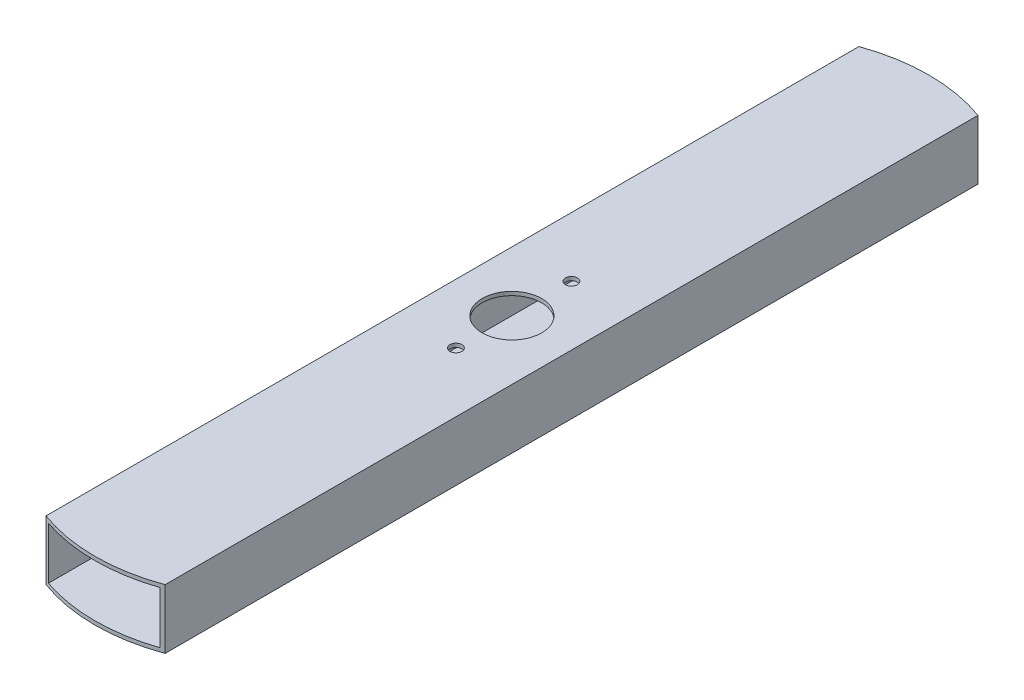
ISO-10303-21;
HEADER;
FILE_DESCRIPTION(('STEP AP214'),'2;1');
FILE_NAME('part.step','',(''),(''),'','','');
FILE_SCHEMA(('AUTOMOTIVE_DESIGN { 1 0 10303 214 1 1 1 1 }'));
ENDSEC;
DATA;
#1=APPLICATION_CONTEXT('core data for automotive mechanical design processes');
#2=APPLICATION_PROTOCOL_DEFINITION('international standard','automotive_design',2000,#1);
#3=PRODUCT_CONTEXT('',#1,'mechanical');
#4=PRODUCT('Part','Part','',(#3));
#5=PRODUCT_RELATED_PRODUCT_CATEGORY('part','',(#4));
#6=PRODUCT_DEFINITION_FORMATION('','',#4);
#7=PRODUCT_DEFINITION_CONTEXT('part definition',#1,'design');
#8=PRODUCT_DEFINITION('design','',#6,#7);
#9=PRODUCT_DEFINITION_SHAPE('','',#8);
#10=(LENGTH_UNIT() NAMED_UNIT(*) SI_UNIT(.MILLI.,.METRE.));
#11=(NAMED_UNIT(*) PLANE_ANGLE_UNIT() SI_UNIT($,.RADIAN.));
#12=(NAMED_UNIT(*) SI_UNIT($,.STERADIAN.) SOLID_ANGLE_UNIT());
#13=UNCERTAINTY_MEASURE_WITH_UNIT(LENGTH_MEASURE(1.E-05),#10,'distance_accuracy_value','');
#14=(GEOMETRIC_REPRESENTATION_CONTEXT(3) GLOBAL_UNCERTAINTY_ASSIGNED_CONTEXT((#13)) GLOBAL_UNIT_ASSIGNED_CONTEXT((#10,
#11,#12)) REPRESENTATION_CONTEXT('',''));
#15=CARTESIAN_POINT('',(0.,0.,0.));
#16=DIRECTION('',(0.,0.,1.));
#17=DIRECTION('',(1.,0.,0.));
#18=AXIS2_PLACEMENT_3D('',#15,#16,#17);
#19=CARTESIAN_POINT('',(-25.4,-12.7,355.6));
#20=DIRECTION('',(1.,0.,0.));
#21=DIRECTION('',(0.,0.,-1.));
#22=AXIS2_PLACEMENT_3D('',#19,#20,#21);
#23=PLANE('',#22);
#24=DIRECTION('',(0.,-1.,0.));
#25=VECTOR('',#24,1.);
#26=CARTESIAN_POINT('',(-25.4,12.701,351.082140551186));
#27=LINE('',#26,#25);
#28=CARTESIAN_POINT('',(-25.4,12.7,351.082140551186));
#29=VERTEX_POINT('',#28);
#30=CARTESIAN_POINT('',(-25.4,-12.7,351.082140551186));
#31=VERTEX_POINT('',#30);
#32=EDGE_CURVE('E166',#29,#31,#27,.T.);
#33=ORIENTED_EDGE('',*,*,#32,.F.);
#34=DIRECTION('',(0.,0.,-1.));
#35=VECTOR('',#34,1.);
#36=CARTESIAN_POINT('',(-25.4,12.7,355.6));
#37=LINE('',#36,#35);
#38=CARTESIAN_POINT('',(-25.4,12.7,4.43641944120016));
#39=VERTEX_POINT('',#38);
#40=EDGE_CURVE('E188',#29,#39,#37,.T.);
#41=ORIENTED_EDGE('',*,*,#40,.T.);
#42=DIRECTION('',(0.,-1.,0.));
#43=VECTOR('',#42,1.);
#44=CARTESIAN_POINT('',(-25.4,12.701,4.43641944120018));
#45=LINE('',#44,#43);
#46=CARTESIAN_POINT('',(-25.4,-12.7,4.43641944120018));
#47=VERTEX_POINT('',#46);
#48=EDGE_CURVE('E263',#39,#47,#45,.T.);
#49=ORIENTED_EDGE('',*,*,#48,.T.);
#50=DIRECTION('',(0.,0.,-1.));
#51=VECTOR('',#50,1.);
#52=CARTESIAN_POINT('',(-25.4,-12.7,355.6));
#53=LINE('',#52,#51);
#54=EDGE_CURVE('E12',#31,#47,#53,.T.);
#55=ORIENTED_EDGE('',*,*,#54,.F.);
#56=EDGE_LOOP('',(#33,#41,#49,#55));
#57=FACE_BOUND('',#56,.T.);
#58=ADVANCED_FACE('F75',(#57),#23,.F.);
#59=CARTESIAN_POINT('',(25.4,-12.7,355.6));
#60=DIRECTION('',(0.,1.,0.));
#61=DIRECTION('',(-1.,0.,0.));
#62=AXIS2_PLACEMENT_3D('',#59,#60,#61);
#63=PLANE('',#62);
#64=CARTESIAN_POINT('',(0.,-12.7,201.676));
#65=DIRECTION('',(0.,1.,0.));
#66=DIRECTION('',(-1.,0.,0.));
#67=AXIS2_PLACEMENT_3D('',#64,#65,#66);
#68=CIRCLE('',#67,2.54000000000001);
#69=CARTESIAN_POINT('',(-2.53999999999998,-12.7,201.676));
#70=VERTEX_POINT('',#69);
#71=EDGE_CURVE('E172',#70,#70,#68,.T.);
#72=ORIENTED_EDGE('',*,*,#71,.T.);
#73=EDGE_LOOP('',(#72));
#74=FACE_BOUND('',#73,.T.);
#75=CARTESIAN_POINT('',(0.,-12.7,152.4));
#76=DIRECTION('',(0.,1.,0.));
#77=DIRECTION('',(-1.,0.,0.));
#78=AXIS2_PLACEMENT_3D('',#75,#76,#77);
#79=CIRCLE('',#78,2.54);
#80=CARTESIAN_POINT('',(-2.53999999999998,-12.7,152.4));
#81=VERTEX_POINT('',#80);
#82=EDGE_CURVE('E213',#81,#81,#79,.T.);
#83=ORIENTED_EDGE('',*,*,#82,.T.);
#84=EDGE_LOOP('',(#83));
#85=FACE_BOUND('',#84,.T.);
#86=CARTESIAN_POINT('',(0.,-12.7,177.8));
#87=DIRECTION('',(0.,1.,0.));
#88=DIRECTION('',(-1.,0.,0.));
#89=AXIS2_PLACEMENT_3D('',#86,#87,#88);
#90=CIRCLE('',#89,12.7);
#91=CARTESIAN_POINT('',(-12.7,-12.7,177.8));
#92=VERTEX_POINT('',#91);
#93=EDGE_CURVE('E207',#92,#92,#90,.T.);
#94=ORIENTED_EDGE('',*,*,#93,.T.);
#95=EDGE_LOOP('',(#94));
#96=FACE_BOUND('',#95,.T.);
#97=CARTESIAN_POINT('',(0.,-12.7,281.94));
#98=DIRECTION('',(0.,-1.,0.));
#99=DIRECTION('',(1.,0.,0.));
#100=AXIS2_PLACEMENT_3D('',#97,#98,#99);
#101=CIRCLE('',#100,73.66);
#102=CARTESIAN_POINT('',(25.4,-12.7,351.082140551186));
#103=VERTEX_POINT('',#102);
#104=EDGE_CURVE('E94',#103,#31,#101,.T.);
#105=ORIENTED_EDGE('',*,*,#104,.T.);
#106=ORIENTED_EDGE('',*,*,#54,.T.);
#107=CARTESIAN_POINT('',(0.,-12.7,74.93));
#108=DIRECTION('',(0.,-1.,0.));
#109=DIRECTION('',(1.,0.,0.));
#110=AXIS2_PLACEMENT_3D('',#107,#108,#109);
#111=CIRCLE('',#110,74.93);
#112=CARTESIAN_POINT('',(25.4,-12.7,4.43641944120018));
#113=VERTEX_POINT('',#112);
#114=EDGE_CURVE('E267',#47,#113,#111,.T.);
#115=ORIENTED_EDGE('',*,*,#114,.T.);
#116=DIRECTION('',(0.,0.,-1.));
#117=VECTOR('',#116,1.);
#118=CARTESIAN_POINT('',(25.4,-12.7,355.6));
#119=LINE('',#118,#117);
#120=EDGE_CURVE('E85',#103,#113,#119,.T.);
#121=ORIENTED_EDGE('',*,*,#120,.F.);
#122=EDGE_LOOP('',(#105,#106,#115,#121));
#123=FACE_BOUND('',#122,.T.);
#124=ADVANCED_FACE('F314',(#74,#85,#96,#123),#63,.F.);
#125=CARTESIAN_POINT('',(25.4,-12.7,355.6));
#126=DIRECTION('',(-1.,0.,0.));
#127=DIRECTION('',(0.,-1.,0.));
#128=AXIS2_PLACEMENT_3D('',#125,#126,#127);
#129=PLANE('',#128);
#130=DIRECTION('',(0.,-1.,0.));
#131=VECTOR('',#130,1.);
#132=CARTESIAN_POINT('',(25.4,12.701,4.43641944120018));
#133=LINE('',#132,#131);
#134=CARTESIAN_POINT('',(25.4,12.7,4.43641944120018));
#135=VERTEX_POINT('',#134);
#136=EDGE_CURVE('E167',#135,#113,#133,.T.);
#137=ORIENTED_EDGE('',*,*,#136,.F.);
#138=DIRECTION('',(0.,0.,-1.));
#139=VECTOR('',#138,1.);
#140=CARTESIAN_POINT('',(25.4,12.7,355.6));
#141=LINE('',#140,#139);
#142=CARTESIAN_POINT('',(25.4,12.7,351.082140551186));
#143=VERTEX_POINT('',#142);
#144=EDGE_CURVE('E191',#143,#135,#141,.T.);
#145=ORIENTED_EDGE('',*,*,#144,.F.);
#146=DIRECTION('',(0.,-1.,0.));
#147=VECTOR('',#146,1.);
#148=CARTESIAN_POINT('',(25.4,12.701,351.082140551186));
#149=LINE('',#148,#147);
#150=EDGE_CURVE('E122',#143,#103,#149,.T.);
#151=ORIENTED_EDGE('',*,*,#150,.T.);
#152=ORIENTED_EDGE('',*,*,#120,.T.);
#153=EDGE_LOOP('',(#137,#145,#151,#152));
#154=FACE_BOUND('',#153,.T.);
#155=ADVANCED_FACE('F312',(#154),#129,.F.);
#156=CARTESIAN_POINT('',(25.4,12.7,355.6));
#157=DIRECTION('',(0.,-1.,0.));
#158=DIRECTION('',(1.,0.,0.));
#159=AXIS2_PLACEMENT_3D('',#156,#157,#158);
#160=PLANE('',#159);
#161=CARTESIAN_POINT('',(0.,12.7,201.676));
#162=DIRECTION('',(0.,1.,0.));
#163=DIRECTION('',(-1.,0.,0.));
#164=AXIS2_PLACEMENT_3D('',#161,#162,#163);
#165=CIRCLE('',#164,2.54000000000001);
#166=CARTESIAN_POINT('',(-2.53999999999998,12.7,201.676));
#167=VERTEX_POINT('',#166);
#168=EDGE_CURVE('E257',#167,#167,#165,.T.);
#169=ORIENTED_EDGE('',*,*,#168,.F.);
#170=EDGE_LOOP('',(#169));
#171=FACE_BOUND('',#170,.T.);
#172=CARTESIAN_POINT('',(0.,12.7,152.4));
#173=DIRECTION('',(0.,1.,0.));
#174=DIRECTION('',(-1.,0.,0.));
#175=AXIS2_PLACEMENT_3D('',#172,#173,#174);
#176=CIRCLE('',#175,2.54);
#177=CARTESIAN_POINT('',(-2.53999999999998,12.7,152.4));
#178=VERTEX_POINT('',#177);
#179=EDGE_CURVE('E254',#178,#178,#176,.T.);
#180=ORIENTED_EDGE('',*,*,#179,.F.);
#181=EDGE_LOOP('',(#180));
#182=FACE_BOUND('',#181,.T.);
#183=CARTESIAN_POINT('',(0.,12.7,177.8));
#184=DIRECTION('',(0.,1.,0.));
#185=DIRECTION('',(-1.,0.,0.));
#186=AXIS2_PLACEMENT_3D('',#183,#184,#185);
#187=CIRCLE('',#186,12.7);
#188=CARTESIAN_POINT('',(-12.7,12.7,177.8));
#189=VERTEX_POINT('',#188);
#190=EDGE_CURVE('E202',#189,#189,#187,.T.);
#191=ORIENTED_EDGE('',*,*,#190,.F.);
#192=EDGE_LOOP('',(#191));
#193=FACE_BOUND('',#192,.T.);
#194=ORIENTED_EDGE('',*,*,#40,.F.);
#195=CARTESIAN_POINT('',(0.,12.7,281.94));
#196=DIRECTION('',(0.,-1.,0.));
#197=DIRECTION('',(1.,0.,0.));
#198=AXIS2_PLACEMENT_3D('',#195,#196,#197);
#199=CIRCLE('',#198,73.66);
#200=EDGE_CURVE('E159',#29,#143,#199,.F.);
#201=ORIENTED_EDGE('',*,*,#200,.T.);
#202=ORIENTED_EDGE('',*,*,#144,.T.);
#203=CARTESIAN_POINT('',(0.,12.7,74.93));
#204=DIRECTION('',(0.,-1.,0.));
#205=DIRECTION('',(1.,0.,0.));
#206=AXIS2_PLACEMENT_3D('',#203,#204,#205);
#207=CIRCLE('',#206,74.93);
#208=EDGE_CURVE('E278',#135,#39,#207,.F.);
#209=ORIENTED_EDGE('',*,*,#208,.T.);
#210=EDGE_LOOP('',(#194,#201,#202,#209));
#211=FACE_BOUND('',#210,.T.);
#212=ADVANCED_FACE('F309',(#171,#182,#193,#211),#160,.F.);
#213=CARTESIAN_POINT('',(-23.8125,-11.1125,355.6));
#214=DIRECTION('',(1.,0.,0.));
#215=DIRECTION('',(0.,0.,-1.));
#216=AXIS2_PLACEMENT_3D('',#213,#214,#215);
#217=PLANE('',#216);
#218=DIRECTION('',(0.,0.,-1.));
#219=VECTOR('',#218,1.);
#220=CARTESIAN_POINT('',(-23.8125,11.1125,355.6));
#221=LINE('',#220,#219);
#222=CARTESIAN_POINT('',(-23.8125,11.1125,351.644809330132));
#223=VERTEX_POINT('',#222);
#224=CARTESIAN_POINT('',(-23.8125,11.1125,3.88445303363483));
#225=VERTEX_POINT('',#224);
#226=EDGE_CURVE('E151',#223,#225,#221,.T.);
#227=ORIENTED_EDGE('',*,*,#226,.F.);
#228=DIRECTION('',(0.,-1.,0.));
#229=VECTOR('',#228,1.);
#230=CARTESIAN_POINT('',(-23.8125,12.701,351.644809330132));
#231=LINE('',#230,#229);
#232=CARTESIAN_POINT('',(-23.8125,-11.1125,351.644809330132));
#233=VERTEX_POINT('',#232);
#234=EDGE_CURVE('E161',#233,#223,#231,.F.);
#235=ORIENTED_EDGE('',*,*,#234,.F.);
#236=DIRECTION('',(0.,0.,-1.));
#237=VECTOR('',#236,1.);
#238=CARTESIAN_POINT('',(-23.8125,-11.1125,355.6));
#239=LINE('',#238,#237);
#240=CARTESIAN_POINT('',(-23.8125,-11.1125,3.88445303363483));
#241=VERTEX_POINT('',#240);
#242=EDGE_CURVE('E113',#233,#241,#239,.T.);
#243=ORIENTED_EDGE('',*,*,#242,.T.);
#244=DIRECTION('',(0.,-1.,0.));
#245=VECTOR('',#244,1.);
#246=CARTESIAN_POINT('',(-23.8125,12.701,3.88445303363483));
#247=LINE('',#246,#245);
#248=EDGE_CURVE('E170',#225,#241,#247,.T.);
#249=ORIENTED_EDGE('',*,*,#248,.F.);
#250=EDGE_LOOP('',(#227,#235,#243,#249));
#251=FACE_BOUND('',#250,.T.);
#252=ADVANCED_FACE('F169',(#251),#217,.T.);
#253=CARTESIAN_POINT('',(23.8125,-11.1125,355.6));
#254=DIRECTION('',(0.,1.,0.));
#255=DIRECTION('',(-1.,0.,0.));
#256=AXIS2_PLACEMENT_3D('',#253,#254,#255);
#257=PLANE('',#256);
#258=CARTESIAN_POINT('',(0.,-11.1125,201.676));
#259=DIRECTION('',(0.,1.,0.));
#260=DIRECTION('',(-1.,0.,0.));
#261=AXIS2_PLACEMENT_3D('',#258,#259,#260);
#262=CIRCLE('',#261,2.54000000000001);
#263=CARTESIAN_POINT('',(-2.53999999999998,-11.1125,201.676));
#264=VERTEX_POINT('',#263);
#265=EDGE_CURVE('E179',#264,#264,#262,.T.);
#266=ORIENTED_EDGE('',*,*,#265,.F.);
#267=EDGE_LOOP('',(#266));
#268=FACE_BOUND('',#267,.T.);
#269=CARTESIAN_POINT('',(0.,-11.1125,152.4));
#270=DIRECTION('',(0.,1.,0.));
#271=DIRECTION('',(-1.,0.,0.));
#272=AXIS2_PLACEMENT_3D('',#269,#270,#271);
#273=CIRCLE('',#272,2.54);
#274=CARTESIAN_POINT('',(-2.53999999999998,-11.1125,152.4));
#275=VERTEX_POINT('',#274);
#276=EDGE_CURVE('E206',#275,#275,#273,.T.);
#277=ORIENTED_EDGE('',*,*,#276,.F.);
#278=EDGE_LOOP('',(#277));
#279=FACE_BOUND('',#278,.T.);
#280=CARTESIAN_POINT('',(0.,-11.1125,177.8));
#281=DIRECTION('',(0.,1.,0.));
#282=DIRECTION('',(-1.,0.,0.));
#283=AXIS2_PLACEMENT_3D('',#280,#281,#282);
#284=CIRCLE('',#283,12.7);
#285=CARTESIAN_POINT('',(-12.7,-11.1125,177.8));
#286=VERTEX_POINT('',#285);
#287=EDGE_CURVE('E201',#286,#286,#284,.T.);
#288=ORIENTED_EDGE('',*,*,#287,.F.);
#289=EDGE_LOOP('',(#288));
#290=FACE_BOUND('',#289,.T.);
#291=ORIENTED_EDGE('',*,*,#242,.F.);
#292=CARTESIAN_POINT('',(0.,-11.1125,281.94));
#293=DIRECTION('',(0.,1.,0.));
#294=DIRECTION('',(-1.,0.,0.));
#295=AXIS2_PLACEMENT_3D('',#292,#293,#294);
#296=CIRCLE('',#295,73.66);
#297=CARTESIAN_POINT('',(23.8125,-11.1125,351.644809330132));
#298=VERTEX_POINT('',#297);
#299=EDGE_CURVE('E164',#298,#233,#296,.F.);
#300=ORIENTED_EDGE('',*,*,#299,.F.);
#301=DIRECTION('',(0.,0.,-1.));
#302=VECTOR('',#301,1.);
#303=CARTESIAN_POINT('',(23.8125,-11.1125,355.6));
#304=LINE('',#303,#302);
#305=CARTESIAN_POINT('',(23.8125,-11.1125,3.88445303363483));
#306=VERTEX_POINT('',#305);
#307=EDGE_CURVE('E176',#298,#306,#304,.T.);
#308=ORIENTED_EDGE('',*,*,#307,.T.);
#309=CARTESIAN_POINT('',(0.,-11.1125,74.93));
#310=DIRECTION('',(0.,1.,0.));
#311=DIRECTION('',(-1.,0.,0.));
#312=AXIS2_PLACEMENT_3D('',#309,#310,#311);
#313=CIRCLE('',#312,74.93);
#314=EDGE_CURVE('E272',#241,#306,#313,.F.);
#315=ORIENTED_EDGE('',*,*,#314,.F.);
#316=EDGE_LOOP('',(#291,#300,#308,#315));
#317=FACE_BOUND('',#316,.T.);
#318=ADVANCED_FACE('F329',(#268,#279,#290,#317),#257,.T.);
#319=CARTESIAN_POINT('',(23.8125,-11.1125,355.6));
#320=DIRECTION('',(-1.,0.,0.));
#321=DIRECTION('',(0.,0.,1.));
#322=AXIS2_PLACEMENT_3D('',#319,#320,#321);
#323=PLANE('',#322);
#324=DIRECTION('',(0.,0.,-1.));
#325=VECTOR('',#324,1.);
#326=CARTESIAN_POINT('',(23.8125,11.1125,355.6));
#327=LINE('',#326,#325);
#328=CARTESIAN_POINT('',(23.8125,11.1125,351.644809330132));
#329=VERTEX_POINT('',#328);
#330=CARTESIAN_POINT('',(23.8125,11.1125,3.88445303363483));
#331=VERTEX_POINT('',#330);
#332=EDGE_CURVE('E154',#329,#331,#327,.T.);
#333=ORIENTED_EDGE('',*,*,#332,.T.);
#334=DIRECTION('',(0.,-1.,0.));
#335=VECTOR('',#334,1.);
#336=CARTESIAN_POINT('',(23.8125,12.701,3.88445303363483));
#337=LINE('',#336,#335);
#338=EDGE_CURVE('E295',#306,#331,#337,.F.);
#339=ORIENTED_EDGE('',*,*,#338,.F.);
#340=ORIENTED_EDGE('',*,*,#307,.F.);
#341=DIRECTION('',(0.,-1.,0.));
#342=VECTOR('',#341,1.);
#343=CARTESIAN_POINT('',(23.8125,12.701,351.644809330132));
#344=LINE('',#343,#342);
#345=EDGE_CURVE('E158',#329,#298,#344,.T.);
#346=ORIENTED_EDGE('',*,*,#345,.F.);
#347=EDGE_LOOP('',(#333,#339,#340,#346));
#348=FACE_BOUND('',#347,.T.);
#349=ADVANCED_FACE('F240',(#348),#323,.T.);
#350=CARTESIAN_POINT('',(23.8125,11.1125,355.6));
#351=DIRECTION('',(0.,-1.,0.));
#352=DIRECTION('',(1.,0.,0.));
#353=AXIS2_PLACEMENT_3D('',#350,#351,#352);
#354=PLANE('',#353);
#355=CARTESIAN_POINT('',(0.,11.1125,201.676));
#356=DIRECTION('',(0.,-1.,0.));
#357=DIRECTION('',(1.,0.,0.));
#358=AXIS2_PLACEMENT_3D('',#355,#356,#357);
#359=CIRCLE('',#358,2.54000000000001);
#360=CARTESIAN_POINT('',(2.54000000000003,11.1125,201.676));
#361=VERTEX_POINT('',#360);
#362=EDGE_CURVE('E78',#361,#361,#359,.T.);
#363=ORIENTED_EDGE('',*,*,#362,.F.);
#364=EDGE_LOOP('',(#363));
#365=FACE_BOUND('',#364,.T.);
#366=CARTESIAN_POINT('',(0.,11.1125,152.4));
#367=DIRECTION('',(0.,-1.,0.));
#368=DIRECTION('',(1.,0.,0.));
#369=AXIS2_PLACEMENT_3D('',#366,#367,#368);
#370=CIRCLE('',#369,2.54);
#371=CARTESIAN_POINT('',(2.54000000000002,11.1125,152.4));
#372=VERTEX_POINT('',#371);
#373=EDGE_CURVE('E203',#372,#372,#370,.T.);
#374=ORIENTED_EDGE('',*,*,#373,.F.);
#375=EDGE_LOOP('',(#374));
#376=FACE_BOUND('',#375,.T.);
#377=CARTESIAN_POINT('',(0.,11.1125,177.8));
#378=DIRECTION('',(0.,-1.,0.));
#379=DIRECTION('',(1.,0.,0.));
#380=AXIS2_PLACEMENT_3D('',#377,#378,#379);
#381=CIRCLE('',#380,12.7);
#382=CARTESIAN_POINT('',(12.7,11.1125,177.8));
#383=VERTEX_POINT('',#382);
#384=EDGE_CURVE('E198',#383,#383,#381,.T.);
#385=ORIENTED_EDGE('',*,*,#384,.F.);
#386=EDGE_LOOP('',(#385));
#387=FACE_BOUND('',#386,.T.);
#388=CARTESIAN_POINT('',(0.,11.1125,281.94));
#389=DIRECTION('',(0.,-1.,0.));
#390=DIRECTION('',(1.,0.,0.));
#391=AXIS2_PLACEMENT_3D('',#388,#389,#390);
#392=CIRCLE('',#391,73.66);
#393=EDGE_CURVE('E147',#223,#329,#392,.F.);
#394=ORIENTED_EDGE('',*,*,#393,.F.);
#395=ORIENTED_EDGE('',*,*,#226,.T.);
#396=CARTESIAN_POINT('',(0.,11.1125,74.93));
#397=DIRECTION('',(0.,-1.,0.));
#398=DIRECTION('',(1.,0.,0.));
#399=AXIS2_PLACEMENT_3D('',#396,#397,#398);
#400=CIRCLE('',#399,74.93);
#401=EDGE_CURVE('E275',#331,#225,#400,.F.);
#402=ORIENTED_EDGE('',*,*,#401,.F.);
#403=ORIENTED_EDGE('',*,*,#332,.F.);
#404=EDGE_LOOP('',(#394,#395,#402,#403));
#405=FACE_BOUND('',#404,.T.);
#406=ADVANCED_FACE('F149',(#365,#376,#387,#405),#354,.T.);
#407=CARTESIAN_POINT('',(0.,-20.066,177.8));
#408=DIRECTION('',(0.,1.,0.));
#409=DIRECTION('',(-1.,0.,0.));
#410=AXIS2_PLACEMENT_3D('',#407,#408,#409);
#411=CYLINDRICAL_SURFACE('',#410,12.7);
#412=ORIENTED_EDGE('',*,*,#384,.T.);
#413=EDGE_LOOP('',(#412));
#414=FACE_BOUND('',#413,.T.);
#415=ORIENTED_EDGE('',*,*,#190,.T.);
#416=EDGE_LOOP('',(#415));
#417=FACE_BOUND('',#416,.T.);
#418=ADVANCED_FACE('F239',(#414,#417),#411,.F.);
#419=CARTESIAN_POINT('',(0.,-20.066,152.4));
#420=DIRECTION('',(0.,1.,0.));
#421=DIRECTION('',(-1.,0.,0.));
#422=AXIS2_PLACEMENT_3D('',#419,#420,#421);
#423=CYLINDRICAL_SURFACE('',#422,2.54);
#424=ORIENTED_EDGE('',*,*,#373,.T.);
#425=EDGE_LOOP('',(#424));
#426=FACE_BOUND('',#425,.T.);
#427=ORIENTED_EDGE('',*,*,#179,.T.);
#428=EDGE_LOOP('',(#427));
#429=FACE_BOUND('',#428,.T.);
#430=ADVANCED_FACE('F247',(#426,#429),#423,.F.);
#431=CARTESIAN_POINT('',(0.,-20.066,201.676));
#432=DIRECTION('',(0.,1.,0.));
#433=DIRECTION('',(-1.,0.,0.));
#434=AXIS2_PLACEMENT_3D('',#431,#432,#433);
#435=CYLINDRICAL_SURFACE('',#434,2.54000000000001);
#436=ORIENTED_EDGE('',*,*,#362,.T.);
#437=EDGE_LOOP('',(#436));
#438=FACE_BOUND('',#437,.T.);
#439=ORIENTED_EDGE('',*,*,#168,.T.);
#440=EDGE_LOOP('',(#439));
#441=FACE_BOUND('',#440,.T.);
#442=ADVANCED_FACE('F234',(#438,#441),#435,.F.);
#443=ORIENTED_EDGE('',*,*,#287,.T.);
#444=EDGE_LOOP('',(#443));
#445=FACE_BOUND('',#444,.T.);
#446=ORIENTED_EDGE('',*,*,#93,.F.);
#447=EDGE_LOOP('',(#446));
#448=FACE_BOUND('',#447,.T.);
#449=ADVANCED_FACE('F249',(#445,#448),#411,.F.);
#450=ORIENTED_EDGE('',*,*,#276,.T.);
#451=EDGE_LOOP('',(#450));
#452=FACE_BOUND('',#451,.T.);
#453=ORIENTED_EDGE('',*,*,#82,.F.);
#454=EDGE_LOOP('',(#453));
#455=FACE_BOUND('',#454,.T.);
#456=ADVANCED_FACE('F341',(#452,#455),#423,.F.);
#457=ORIENTED_EDGE('',*,*,#265,.T.);
#458=EDGE_LOOP('',(#457));
#459=FACE_BOUND('',#458,.T.);
#460=ORIENTED_EDGE('',*,*,#71,.F.);
#461=EDGE_LOOP('',(#460));
#462=FACE_BOUND('',#461,.T.);
#463=ADVANCED_FACE('F338',(#459,#462),#435,.F.);
#464=CARTESIAN_POINT('',(0.,12.701,74.93));
#465=DIRECTION('',(0.,-1.,0.));
#466=DIRECTION('',(1.,0.,0.));
#467=AXIS2_PLACEMENT_3D('',#464,#465,#466);
#468=CYLINDRICAL_SURFACE('',#467,74.93);
#469=ORIENTED_EDGE('',*,*,#136,.T.);
#470=ORIENTED_EDGE('',*,*,#114,.F.);
#471=ORIENTED_EDGE('',*,*,#48,.F.);
#472=ORIENTED_EDGE('',*,*,#208,.F.);
#473=EDGE_LOOP('',(#469,#470,#471,#472));
#474=FACE_BOUND('',#473,.T.);
#475=ORIENTED_EDGE('',*,*,#314,.T.);
#476=ORIENTED_EDGE('',*,*,#338,.T.);
#477=ORIENTED_EDGE('',*,*,#401,.T.);
#478=ORIENTED_EDGE('',*,*,#248,.T.);
#479=EDGE_LOOP('',(#475,#476,#477,#478));
#480=FACE_BOUND('',#479,.T.);
#481=ADVANCED_FACE('F305',(#474,#480),#468,.T.);
#482=CARTESIAN_POINT('',(0.,12.701,281.94));
#483=DIRECTION('',(0.,-1.,0.));
#484=DIRECTION('',(1.,0.,0.));
#485=AXIS2_PLACEMENT_3D('',#482,#483,#484);
#486=CYLINDRICAL_SURFACE('',#485,73.66);
#487=ORIENTED_EDGE('',*,*,#32,.T.);
#488=ORIENTED_EDGE('',*,*,#104,.F.);
#489=ORIENTED_EDGE('',*,*,#150,.F.);
#490=ORIENTED_EDGE('',*,*,#200,.F.);
#491=EDGE_LOOP('',(#487,#488,#489,#490));
#492=FACE_BOUND('',#491,.T.);
#493=ORIENTED_EDGE('',*,*,#299,.T.);
#494=ORIENTED_EDGE('',*,*,#234,.T.);
#495=ORIENTED_EDGE('',*,*,#393,.T.);
#496=ORIENTED_EDGE('',*,*,#345,.T.);
#497=EDGE_LOOP('',(#493,#494,#495,#496));
#498=FACE_BOUND('',#497,.T.);
#499=ADVANCED_FACE('F162',(#492,#498),#486,.T.);
#500=CLOSED_SHELL('',(#58,#124,#155,#212,#252,#318,#349,#406,#418,#430,#442,#449,#456,#463,#481,#499));
#501=MANIFOLD_SOLID_BREP('B2',#500);
#502=ADVANCED_BREP_SHAPE_REPRESENTATION('',(#18,#501),#14);
#503=SHAPE_DEFINITION_REPRESENTATION(#9,#502);
ENDSEC;
END-ISO-10303-21;
